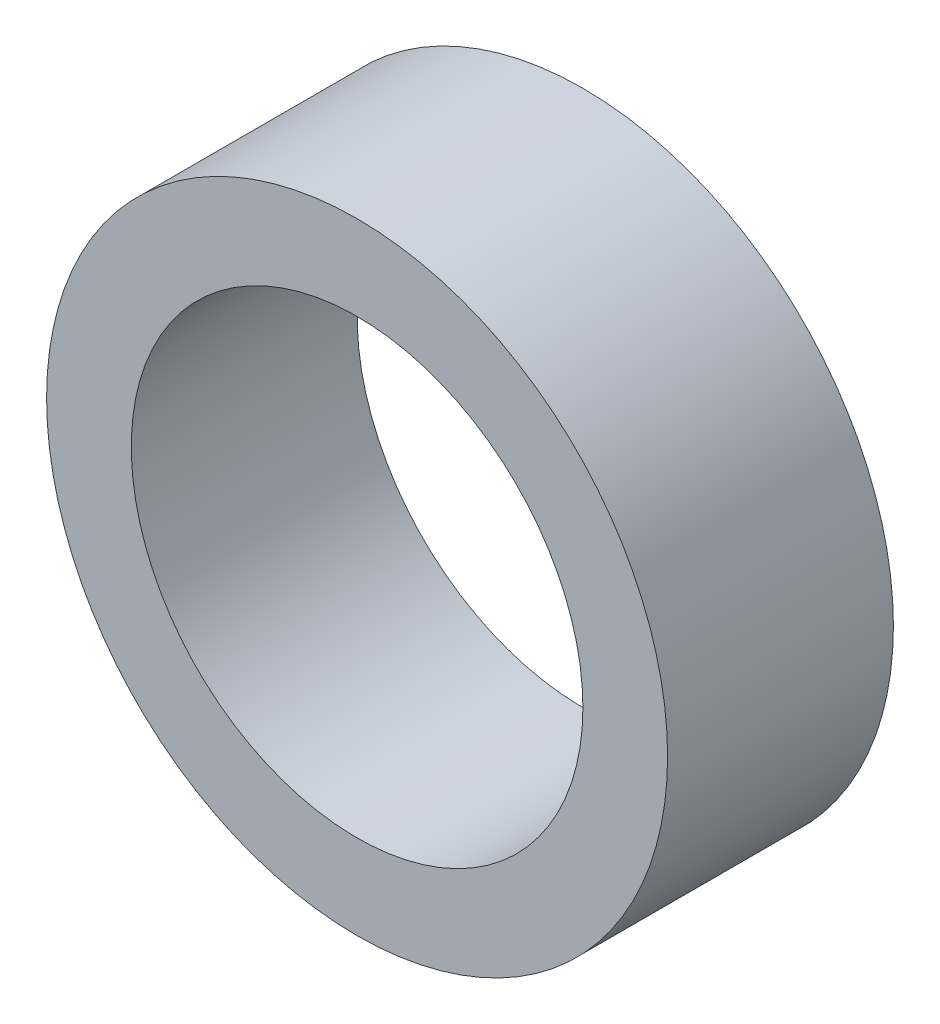
ISO-10303-21;
HEADER;
FILE_DESCRIPTION(('STEP AP214'),'2;1');
FILE_NAME('part.step','',(''),(''),'','','');
FILE_SCHEMA(('AUTOMOTIVE_DESIGN { 1 0 10303 214 1 1 1 1 }'));
ENDSEC;
DATA;
#1=APPLICATION_CONTEXT('core data for automotive mechanical design processes');
#2=APPLICATION_PROTOCOL_DEFINITION('international standard','automotive_design',2000,#1);
#3=PRODUCT_CONTEXT('',#1,'mechanical');
#4=PRODUCT('Part','Part','',(#3));
#5=PRODUCT_RELATED_PRODUCT_CATEGORY('part','',(#4));
#6=PRODUCT_DEFINITION_FORMATION('','',#4);
#7=PRODUCT_DEFINITION_CONTEXT('part definition',#1,'design');
#8=PRODUCT_DEFINITION('design','',#6,#7);
#9=PRODUCT_DEFINITION_SHAPE('','',#8);
#10=(LENGTH_UNIT() NAMED_UNIT(*) SI_UNIT(.MILLI.,.METRE.));
#11=(NAMED_UNIT(*) PLANE_ANGLE_UNIT() SI_UNIT($,.RADIAN.));
#12=(NAMED_UNIT(*) SI_UNIT($,.STERADIAN.) SOLID_ANGLE_UNIT());
#13=UNCERTAINTY_MEASURE_WITH_UNIT(LENGTH_MEASURE(1.E-05),#10,'distance_accuracy_value','');
#14=(GEOMETRIC_REPRESENTATION_CONTEXT(3) GLOBAL_UNCERTAINTY_ASSIGNED_CONTEXT((#13)) GLOBAL_UNIT_ASSIGNED_CONTEXT((#10,
#11,#12)) REPRESENTATION_CONTEXT('',''));
#15=CARTESIAN_POINT('',(0.,0.,0.));
#16=DIRECTION('',(0.,0.,1.));
#17=DIRECTION('',(1.,0.,0.));
#18=AXIS2_PLACEMENT_3D('',#15,#16,#17);
#19=CARTESIAN_POINT('',(0.,0.,4.));
#20=DIRECTION('',(0.,0.,-1.));
#21=DIRECTION('',(-1.,0.,0.));
#22=AXIS2_PLACEMENT_3D('',#19,#20,#21);
#23=CYLINDRICAL_SURFACE('',#22,5.5);
#24=CARTESIAN_POINT('',(0.,0.,4.));
#25=DIRECTION('',(0.,0.,1.));
#26=DIRECTION('',(1.,0.,0.));
#27=AXIS2_PLACEMENT_3D('',#24,#25,#26);
#28=CIRCLE('',#27,5.5);
#29=CARTESIAN_POINT('',(5.5,0.,4.));
#30=VERTEX_POINT('',#29);
#31=EDGE_CURVE('E10',#30,#30,#28,.T.);
#32=ORIENTED_EDGE('',*,*,#31,.F.);
#33=EDGE_LOOP('',(#32));
#34=FACE_BOUND('',#33,.T.);
#35=CARTESIAN_POINT('',(0.,0.,0.));
#36=DIRECTION('',(0.,0.,1.));
#37=DIRECTION('',(1.,0.,0.));
#38=AXIS2_PLACEMENT_3D('',#35,#36,#37);
#39=CIRCLE('',#38,5.5);
#40=CARTESIAN_POINT('',(5.5,0.,0.));
#41=VERTEX_POINT('',#40);
#42=EDGE_CURVE('E33',#41,#41,#39,.T.);
#43=ORIENTED_EDGE('',*,*,#42,.T.);
#44=EDGE_LOOP('',(#43));
#45=FACE_BOUND('',#44,.T.);
#46=ADVANCED_FACE('F27',(#34,#45),#23,.T.);
#47=CARTESIAN_POINT('',(0.,0.,4.));
#48=DIRECTION('',(0.,0.,1.));
#49=DIRECTION('',(1.,0.,0.));
#50=AXIS2_PLACEMENT_3D('',#47,#48,#49);
#51=PLANE('',#50);
#52=CARTESIAN_POINT('',(0.,0.,4.));
#53=DIRECTION('',(0.,0.,1.));
#54=DIRECTION('',(1.,0.,0.));
#55=AXIS2_PLACEMENT_3D('',#52,#53,#54);
#56=CIRCLE('',#55,4.);
#57=CARTESIAN_POINT('',(4.,0.,4.));
#58=VERTEX_POINT('',#57);
#59=EDGE_CURVE('E41',#58,#58,#56,.T.);
#60=ORIENTED_EDGE('',*,*,#59,.F.);
#61=EDGE_LOOP('',(#60));
#62=FACE_BOUND('',#61,.T.);
#63=ORIENTED_EDGE('',*,*,#31,.T.);
#64=EDGE_LOOP('',(#63));
#65=FACE_BOUND('',#64,.T.);
#66=ADVANCED_FACE('F49',(#62,#65),#51,.T.);
#67=CARTESIAN_POINT('',(0.,0.,0.));
#68=DIRECTION('',(0.,0.,1.));
#69=DIRECTION('',(1.,0.,0.));
#70=AXIS2_PLACEMENT_3D('',#67,#68,#69);
#71=PLANE('',#70);
#72=CARTESIAN_POINT('',(0.,0.,0.));
#73=DIRECTION('',(0.,0.,1.));
#74=DIRECTION('',(1.,0.,0.));
#75=AXIS2_PLACEMENT_3D('',#72,#73,#74);
#76=CIRCLE('',#75,4.);
#77=CARTESIAN_POINT('',(4.,0.,0.));
#78=VERTEX_POINT('',#77);
#79=EDGE_CURVE('E37',#78,#78,#76,.T.);
#80=ORIENTED_EDGE('',*,*,#79,.T.);
#81=EDGE_LOOP('',(#80));
#82=FACE_BOUND('',#81,.T.);
#83=ORIENTED_EDGE('',*,*,#42,.F.);
#84=EDGE_LOOP('',(#83));
#85=FACE_BOUND('',#84,.T.);
#86=ADVANCED_FACE('F51',(#82,#85),#71,.F.);
#87=CARTESIAN_POINT('',(0.,0.,0.));
#88=DIRECTION('',(0.,0.,1.));
#89=DIRECTION('',(1.,0.,0.));
#90=AXIS2_PLACEMENT_3D('',#87,#88,#89);
#91=CYLINDRICAL_SURFACE('',#90,4.);
#92=ORIENTED_EDGE('',*,*,#79,.F.);
#93=EDGE_LOOP('',(#92));
#94=FACE_BOUND('',#93,.T.);
#95=ORIENTED_EDGE('',*,*,#59,.T.);
#96=EDGE_LOOP('',(#95));
#97=FACE_BOUND('',#96,.T.);
#98=ADVANCED_FACE('F47',(#94,#97),#91,.F.);
#99=CLOSED_SHELL('',(#46,#66,#86,#98));
#100=MANIFOLD_SOLID_BREP('B2',#99);
#101=ADVANCED_BREP_SHAPE_REPRESENTATION('',(#18,#100),#14);
#102=SHAPE_DEFINITION_REPRESENTATION(#9,#101);
ENDSEC;
END-ISO-10303-21;
